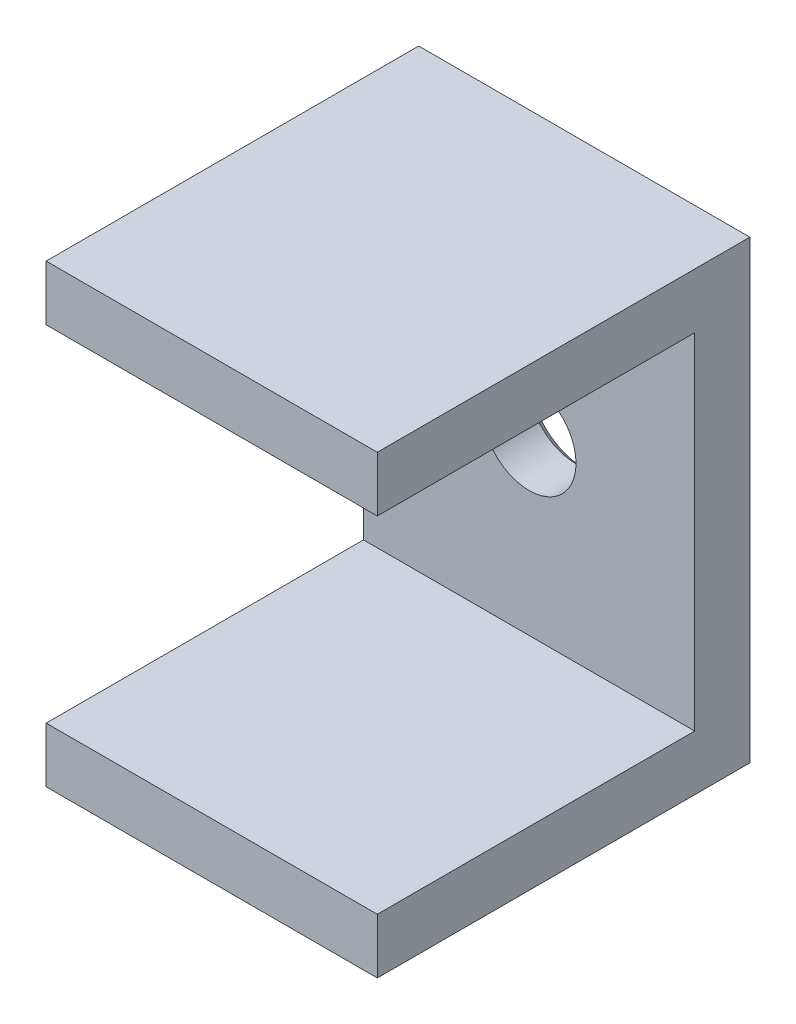
ISO-10303-21;
HEADER;
FILE_DESCRIPTION(('STEP AP214'),'2;1');
FILE_NAME('part.step','',(''),(''),'','','');
FILE_SCHEMA(('AUTOMOTIVE_DESIGN { 1 0 10303 214 1 1 1 1 }'));
ENDSEC;
DATA;
#1=APPLICATION_CONTEXT('core data for automotive mechanical design processes');
#2=APPLICATION_PROTOCOL_DEFINITION('international standard','automotive_design',2000,#1);
#3=PRODUCT_CONTEXT('',#1,'mechanical');
#4=PRODUCT('Part','Part','',(#3));
#5=PRODUCT_RELATED_PRODUCT_CATEGORY('part','',(#4));
#6=PRODUCT_DEFINITION_FORMATION('','',#4);
#7=PRODUCT_DEFINITION_CONTEXT('part definition',#1,'design');
#8=PRODUCT_DEFINITION('design','',#6,#7);
#9=PRODUCT_DEFINITION_SHAPE('','',#8);
#10=(LENGTH_UNIT() NAMED_UNIT(*) SI_UNIT(.MILLI.,.METRE.));
#11=(NAMED_UNIT(*) PLANE_ANGLE_UNIT() SI_UNIT($,.RADIAN.));
#12=(NAMED_UNIT(*) SI_UNIT($,.STERADIAN.) SOLID_ANGLE_UNIT());
#13=UNCERTAINTY_MEASURE_WITH_UNIT(LENGTH_MEASURE(1.E-05),#10,'distance_accuracy_value','');
#14=(GEOMETRIC_REPRESENTATION_CONTEXT(3) GLOBAL_UNCERTAINTY_ASSIGNED_CONTEXT((#13)) GLOBAL_UNIT_ASSIGNED_CONTEXT((#10,
#11,#12)) REPRESENTATION_CONTEXT('',''));
#15=CARTESIAN_POINT('',(0.,0.,0.));
#16=DIRECTION('',(0.,0.,1.));
#17=DIRECTION('',(1.,0.,0.));
#18=AXIS2_PLACEMENT_3D('',#15,#16,#17);
#19=CARTESIAN_POINT('',(-12.,33.,-13.5));
#20=DIRECTION('',(0.,0.,1.));
#21=DIRECTION('',(1.,0.,0.));
#22=AXIS2_PLACEMENT_3D('',#19,#20,#21);
#23=PLANE('',#22);
#24=DIRECTION('',(-1.,0.,0.));
#25=VECTOR('',#24,1.);
#26=CARTESIAN_POINT('',(-12.,0.,-13.5));
#27=LINE('',#26,#25);
#28=CARTESIAN_POINT('',(12.,0.,-13.5));
#29=VERTEX_POINT('',#28);
#30=CARTESIAN_POINT('',(-12.,0.,-13.5));
#31=VERTEX_POINT('',#30);
#32=EDGE_CURVE('E153',#29,#31,#27,.T.);
#33=ORIENTED_EDGE('',*,*,#32,.T.);
#34=DIRECTION('',(0.,-1.,0.));
#35=VECTOR('',#34,1.);
#36=CARTESIAN_POINT('',(-12.,33.,-13.5));
#37=LINE('',#36,#35);
#38=CARTESIAN_POINT('',(-12.,33.,-13.5));
#39=VERTEX_POINT('',#38);
#40=EDGE_CURVE('E51',#39,#31,#37,.T.);
#41=ORIENTED_EDGE('',*,*,#40,.F.);
#42=DIRECTION('',(-1.,0.,0.));
#43=VECTOR('',#42,1.);
#44=CARTESIAN_POINT('',(-12.,33.,-13.5));
#45=LINE('',#44,#43);
#46=CARTESIAN_POINT('',(12.,33.,-13.5));
#47=VERTEX_POINT('',#46);
#48=EDGE_CURVE('E96',#47,#39,#45,.T.);
#49=ORIENTED_EDGE('',*,*,#48,.F.);
#50=DIRECTION('',(0.,-1.,0.));
#51=VECTOR('',#50,1.);
#52=CARTESIAN_POINT('',(12.,33.,-13.5));
#53=LINE('',#52,#51);
#54=EDGE_CURVE('E11',#47,#29,#53,.T.);
#55=ORIENTED_EDGE('',*,*,#54,.T.);
#56=EDGE_LOOP('',(#33,#41,#49,#55));
#57=FACE_BOUND('',#56,.T.);
#58=CARTESIAN_POINT('',(0.,16.5,-13.5));
#59=DIRECTION('',(0.,0.,-1.));
#60=DIRECTION('',(-1.,0.,0.));
#61=AXIS2_PLACEMENT_3D('',#58,#59,#60);
#62=CIRCLE('',#61,4.025);
#63=CARTESIAN_POINT('',(-4.025,16.5,-13.5));
#64=VERTEX_POINT('',#63);
#65=EDGE_CURVE('E288',#64,#64,#62,.T.);
#66=ORIENTED_EDGE('',*,*,#65,.F.);
#67=EDGE_LOOP('',(#66));
#68=FACE_BOUND('',#67,.T.);
#69=ADVANCED_FACE('F43',(#57,#68),#23,.F.);
#70=CARTESIAN_POINT('',(-12.,33.,13.5));
#71=DIRECTION('',(0.,0.,-1.));
#72=DIRECTION('',(-1.,0.,0.));
#73=AXIS2_PLACEMENT_3D('',#70,#71,#72);
#74=PLANE('',#73);
#75=DIRECTION('',(0.,-1.,0.));
#76=VECTOR('',#75,1.);
#77=CARTESIAN_POINT('',(-12.,33.,13.5));
#78=LINE('',#77,#76);
#79=CARTESIAN_POINT('',(-12.,33.,13.5));
#80=VERTEX_POINT('',#79);
#81=CARTESIAN_POINT('',(-12.,29.,13.5));
#82=VERTEX_POINT('',#81);
#83=EDGE_CURVE('E165',#80,#82,#78,.T.);
#84=ORIENTED_EDGE('',*,*,#83,.T.);
#85=DIRECTION('',(-1.,0.,0.));
#86=VECTOR('',#85,1.);
#87=CARTESIAN_POINT('',(-12.,29.,13.5));
#88=LINE('',#87,#86);
#89=CARTESIAN_POINT('',(12.,29.,13.5));
#90=VERTEX_POINT('',#89);
#91=EDGE_CURVE('E132',#90,#82,#88,.T.);
#92=ORIENTED_EDGE('',*,*,#91,.F.);
#93=DIRECTION('',(0.,-1.,0.));
#94=VECTOR('',#93,1.);
#95=CARTESIAN_POINT('',(12.,33.,13.5));
#96=LINE('',#95,#94);
#97=CARTESIAN_POINT('',(12.,33.,13.5));
#98=VERTEX_POINT('',#97);
#99=EDGE_CURVE('E157',#98,#90,#96,.T.);
#100=ORIENTED_EDGE('',*,*,#99,.F.);
#101=DIRECTION('',(1.,0.,0.));
#102=VECTOR('',#101,1.);
#103=CARTESIAN_POINT('',(-12.,33.,13.5));
#104=LINE('',#103,#102);
#105=EDGE_CURVE('E69',#80,#98,#104,.T.);
#106=ORIENTED_EDGE('',*,*,#105,.F.);
#107=EDGE_LOOP('',(#84,#92,#100,#106));
#108=FACE_BOUND('',#107,.T.);
#109=ADVANCED_FACE('F189',(#108),#74,.F.);
#110=CARTESIAN_POINT('',(12.,33.,-13.5));
#111=DIRECTION('',(-1.,0.,0.));
#112=DIRECTION('',(0.,0.,1.));
#113=AXIS2_PLACEMENT_3D('',#110,#111,#112);
#114=PLANE('',#113);
#115=ORIENTED_EDGE('',*,*,#99,.T.);
#116=DIRECTION('',(0.,0.,1.));
#117=VECTOR('',#116,1.);
#118=CARTESIAN_POINT('',(12.,29.,-9.5));
#119=LINE('',#118,#117);
#120=CARTESIAN_POINT('',(12.,29.,-9.5));
#121=VERTEX_POINT('',#120);
#122=EDGE_CURVE('E140',#121,#90,#119,.T.);
#123=ORIENTED_EDGE('',*,*,#122,.F.);
#124=DIRECTION('',(0.,1.,0.));
#125=VECTOR('',#124,1.);
#126=CARTESIAN_POINT('',(12.,29.,-9.5));
#127=LINE('',#126,#125);
#128=CARTESIAN_POINT('',(12.,4.,-9.5));
#129=VERTEX_POINT('',#128);
#130=EDGE_CURVE('E124',#129,#121,#127,.T.);
#131=ORIENTED_EDGE('',*,*,#130,.F.);
#132=DIRECTION('',(0.,0.,1.));
#133=VECTOR('',#132,1.);
#134=CARTESIAN_POINT('',(12.,4.,-9.5));
#135=LINE('',#134,#133);
#136=CARTESIAN_POINT('',(12.,4.,13.5));
#137=VERTEX_POINT('',#136);
#138=EDGE_CURVE('E118',#129,#137,#135,.T.);
#139=ORIENTED_EDGE('',*,*,#138,.T.);
#140=CARTESIAN_POINT('',(12.,0.,13.5));
#141=VERTEX_POINT('',#140);
#142=EDGE_CURVE('E90',#137,#141,#96,.T.);
#143=ORIENTED_EDGE('',*,*,#142,.T.);
#144=DIRECTION('',(0.,0.,-1.));
#145=VECTOR('',#144,1.);
#146=CARTESIAN_POINT('',(12.,0.,-13.5));
#147=LINE('',#146,#145);
#148=EDGE_CURVE('E151',#141,#29,#147,.T.);
#149=ORIENTED_EDGE('',*,*,#148,.T.);
#150=ORIENTED_EDGE('',*,*,#54,.F.);
#151=DIRECTION('',(0.,0.,-1.));
#152=VECTOR('',#151,1.);
#153=CARTESIAN_POINT('',(12.,33.,-13.5));
#154=LINE('',#153,#152);
#155=EDGE_CURVE('E145',#98,#47,#154,.T.);
#156=ORIENTED_EDGE('',*,*,#155,.F.);
#157=EDGE_LOOP('',(#115,#123,#131,#139,#143,#149,#150,#156));
#158=FACE_BOUND('',#157,.T.);
#159=ADVANCED_FACE('F44',(#158),#114,.F.);
#160=CARTESIAN_POINT('',(-12.,33.,-13.5));
#161=DIRECTION('',(1.,0.,0.));
#162=DIRECTION('',(0.,0.,-1.));
#163=AXIS2_PLACEMENT_3D('',#160,#161,#162);
#164=PLANE('',#163);
#165=DIRECTION('',(0.,-1.,0.));
#166=VECTOR('',#165,1.);
#167=CARTESIAN_POINT('',(-12.,4.,-9.5));
#168=LINE('',#167,#166);
#169=CARTESIAN_POINT('',(-12.,29.,-9.5));
#170=VERTEX_POINT('',#169);
#171=CARTESIAN_POINT('',(-12.,4.,-9.5));
#172=VERTEX_POINT('',#171);
#173=EDGE_CURVE('E122',#170,#172,#168,.T.);
#174=ORIENTED_EDGE('',*,*,#173,.F.);
#175=DIRECTION('',(0.,0.,1.));
#176=VECTOR('',#175,1.);
#177=CARTESIAN_POINT('',(-12.,29.,-9.5));
#178=LINE('',#177,#176);
#179=EDGE_CURVE('E152',#170,#82,#178,.T.);
#180=ORIENTED_EDGE('',*,*,#179,.T.);
#181=ORIENTED_EDGE('',*,*,#83,.F.);
#182=DIRECTION('',(0.,0.,1.));
#183=VECTOR('',#182,1.);
#184=CARTESIAN_POINT('',(-12.,33.,-13.5));
#185=LINE('',#184,#183);
#186=EDGE_CURVE('E146',#39,#80,#185,.T.);
#187=ORIENTED_EDGE('',*,*,#186,.F.);
#188=ORIENTED_EDGE('',*,*,#40,.T.);
#189=DIRECTION('',(0.,0.,1.));
#190=VECTOR('',#189,1.);
#191=CARTESIAN_POINT('',(-12.,0.,-13.5));
#192=LINE('',#191,#190);
#193=CARTESIAN_POINT('',(-12.,0.,13.5));
#194=VERTEX_POINT('',#193);
#195=EDGE_CURVE('E156',#31,#194,#192,.T.);
#196=ORIENTED_EDGE('',*,*,#195,.T.);
#197=CARTESIAN_POINT('',(-12.,4.,13.5));
#198=VERTEX_POINT('',#197);
#199=EDGE_CURVE('E139',#198,#194,#78,.T.);
#200=ORIENTED_EDGE('',*,*,#199,.F.);
#201=DIRECTION('',(0.,0.,1.));
#202=VECTOR('',#201,1.);
#203=CARTESIAN_POINT('',(-12.,4.,-9.5));
#204=LINE('',#203,#202);
#205=EDGE_CURVE('E59',#172,#198,#204,.T.);
#206=ORIENTED_EDGE('',*,*,#205,.F.);
#207=EDGE_LOOP('',(#174,#180,#181,#187,#188,#196,#200,#206));
#208=FACE_BOUND('',#207,.T.);
#209=ADVANCED_FACE('F135',(#208),#164,.F.);
#210=ORIENTED_EDGE('',*,*,#142,.F.);
#211=DIRECTION('',(1.,0.,0.));
#212=VECTOR('',#211,1.);
#213=CARTESIAN_POINT('',(12.,4.,13.5));
#214=LINE('',#213,#212);
#215=EDGE_CURVE('E173',#198,#137,#214,.T.);
#216=ORIENTED_EDGE('',*,*,#215,.F.);
#217=ORIENTED_EDGE('',*,*,#199,.T.);
#218=DIRECTION('',(1.,0.,0.));
#219=VECTOR('',#218,1.);
#220=CARTESIAN_POINT('',(-12.,0.,13.5));
#221=LINE('',#220,#219);
#222=EDGE_CURVE('E148',#194,#141,#221,.T.);
#223=ORIENTED_EDGE('',*,*,#222,.T.);
#224=EDGE_LOOP('',(#210,#216,#217,#223));
#225=FACE_BOUND('',#224,.T.);
#226=ADVANCED_FACE('F174',(#225),#74,.F.);
#227=CARTESIAN_POINT('',(0.,33.,0.));
#228=DIRECTION('',(0.,1.,0.));
#229=DIRECTION('',(0.,0.,1.));
#230=AXIS2_PLACEMENT_3D('',#227,#228,#229);
#231=PLANE('',#230);
#232=ORIENTED_EDGE('',*,*,#155,.T.);
#233=ORIENTED_EDGE('',*,*,#48,.T.);
#234=ORIENTED_EDGE('',*,*,#186,.T.);
#235=ORIENTED_EDGE('',*,*,#105,.T.);
#236=EDGE_LOOP('',(#232,#233,#234,#235));
#237=FACE_BOUND('',#236,.T.);
#238=ADVANCED_FACE('F193',(#237),#231,.T.);
#239=CARTESIAN_POINT('',(0.,0.,0.));
#240=DIRECTION('',(0.,1.,0.));
#241=DIRECTION('',(0.,0.,1.));
#242=AXIS2_PLACEMENT_3D('',#239,#240,#241);
#243=PLANE('',#242);
#244=ORIENTED_EDGE('',*,*,#148,.F.);
#245=ORIENTED_EDGE('',*,*,#222,.F.);
#246=ORIENTED_EDGE('',*,*,#195,.F.);
#247=ORIENTED_EDGE('',*,*,#32,.F.);
#248=EDGE_LOOP('',(#244,#245,#246,#247));
#249=FACE_BOUND('',#248,.T.);
#250=ADVANCED_FACE('F171',(#249),#243,.F.);
#251=CARTESIAN_POINT('',(-12.,29.,-9.5));
#252=DIRECTION('',(0.,1.,0.));
#253=DIRECTION('',(0.,0.,1.));
#254=AXIS2_PLACEMENT_3D('',#251,#252,#253);
#255=PLANE('',#254);
#256=ORIENTED_EDGE('',*,*,#91,.T.);
#257=ORIENTED_EDGE('',*,*,#179,.F.);
#258=DIRECTION('',(-1.,0.,0.));
#259=VECTOR('',#258,1.);
#260=CARTESIAN_POINT('',(-12.,29.,-9.5));
#261=LINE('',#260,#259);
#262=EDGE_CURVE('E129',#121,#170,#261,.T.);
#263=ORIENTED_EDGE('',*,*,#262,.F.);
#264=ORIENTED_EDGE('',*,*,#122,.T.);
#265=EDGE_LOOP('',(#256,#257,#263,#264));
#266=FACE_BOUND('',#265,.T.);
#267=ADVANCED_FACE('F186',(#266),#255,.F.);
#268=CARTESIAN_POINT('',(12.,4.,-9.5));
#269=DIRECTION('',(0.,-1.,0.));
#270=DIRECTION('',(1.,0.,0.));
#271=AXIS2_PLACEMENT_3D('',#268,#269,#270);
#272=PLANE('',#271);
#273=ORIENTED_EDGE('',*,*,#215,.T.);
#274=ORIENTED_EDGE('',*,*,#138,.F.);
#275=DIRECTION('',(1.,0.,0.));
#276=VECTOR('',#275,1.);
#277=CARTESIAN_POINT('',(12.,4.,-9.5));
#278=LINE('',#277,#276);
#279=EDGE_CURVE('E116',#172,#129,#278,.T.);
#280=ORIENTED_EDGE('',*,*,#279,.F.);
#281=ORIENTED_EDGE('',*,*,#205,.T.);
#282=EDGE_LOOP('',(#273,#274,#280,#281));
#283=FACE_BOUND('',#282,.T.);
#284=ADVANCED_FACE('F119',(#283),#272,.F.);
#285=CARTESIAN_POINT('',(0.,0.,-9.5));
#286=DIRECTION('',(0.,0.,-1.));
#287=DIRECTION('',(-1.,0.,0.));
#288=AXIS2_PLACEMENT_3D('',#285,#286,#287);
#289=PLANE('',#288);
#290=CARTESIAN_POINT('',(0.,16.5,-9.5));
#291=DIRECTION('',(0.,0.,-1.));
#292=DIRECTION('',(-1.,0.,0.));
#293=AXIS2_PLACEMENT_3D('',#290,#291,#292);
#294=CIRCLE('',#293,3.4);
#295=CARTESIAN_POINT('',(-3.4,16.5,-9.5));
#296=VERTEX_POINT('',#295);
#297=EDGE_CURVE('E175',#296,#296,#294,.T.);
#298=ORIENTED_EDGE('',*,*,#297,.T.);
#299=EDGE_LOOP('',(#298));
#300=FACE_BOUND('',#299,.T.);
#301=ORIENTED_EDGE('',*,*,#173,.T.);
#302=ORIENTED_EDGE('',*,*,#279,.T.);
#303=ORIENTED_EDGE('',*,*,#130,.T.);
#304=ORIENTED_EDGE('',*,*,#262,.T.);
#305=EDGE_LOOP('',(#301,#302,#303,#304));
#306=FACE_BOUND('',#305,.T.);
#307=ADVANCED_FACE('F130',(#300,#306),#289,.F.);
#308=CARTESIAN_POINT('',(0.,16.5,-13.5));
#309=DIRECTION('',(0.,0.,-1.));
#310=DIRECTION('',(-1.,0.,0.));
#311=AXIS2_PLACEMENT_3D('',#308,#309,#310);
#312=CYLINDRICAL_SURFACE('',#311,3.4);
#313=ORIENTED_EDGE('',*,*,#297,.F.);
#314=EDGE_LOOP('',(#313));
#315=FACE_BOUND('',#314,.T.);
#316=CARTESIAN_POINT('',(0.,16.5,-12.875));
#317=DIRECTION('',(0.,0.,-1.));
#318=DIRECTION('',(-1.,0.,0.));
#319=AXIS2_PLACEMENT_3D('',#316,#317,#318);
#320=CIRCLE('',#319,3.4);
#321=CARTESIAN_POINT('',(-3.4,16.5,-12.875));
#322=VERTEX_POINT('',#321);
#323=EDGE_CURVE('E180',#322,#322,#320,.T.);
#324=ORIENTED_EDGE('',*,*,#323,.T.);
#325=EDGE_LOOP('',(#324));
#326=FACE_BOUND('',#325,.T.);
#327=ADVANCED_FACE('F251',(#315,#326),#312,.F.);
#328=CARTESIAN_POINT('',(0.,16.5,-13.5));
#329=DIRECTION('',(0.,0.,-1.));
#330=DIRECTION('',(-1.,0.,0.));
#331=AXIS2_PLACEMENT_3D('',#328,#329,#330);
#332=CONICAL_SURFACE('',#331,4.025,0.785398163397444);
#333=ORIENTED_EDGE('',*,*,#323,.F.);
#334=EDGE_LOOP('',(#333));
#335=FACE_BOUND('',#334,.T.);
#336=ORIENTED_EDGE('',*,*,#65,.T.);
#337=EDGE_LOOP('',(#336));
#338=FACE_BOUND('',#337,.T.);
#339=ADVANCED_FACE('F268',(#335,#338),#332,.F.);
#340=CLOSED_SHELL('',(#69,#109,#159,#209,#226,#238,#250,#267,#284,#307,#327,#339));
#341=MANIFOLD_SOLID_BREP('B2',#340);
#342=ADVANCED_BREP_SHAPE_REPRESENTATION('',(#18,#341),#14);
#343=SHAPE_DEFINITION_REPRESENTATION(#9,#342);
ENDSEC;
END-ISO-10303-21;
